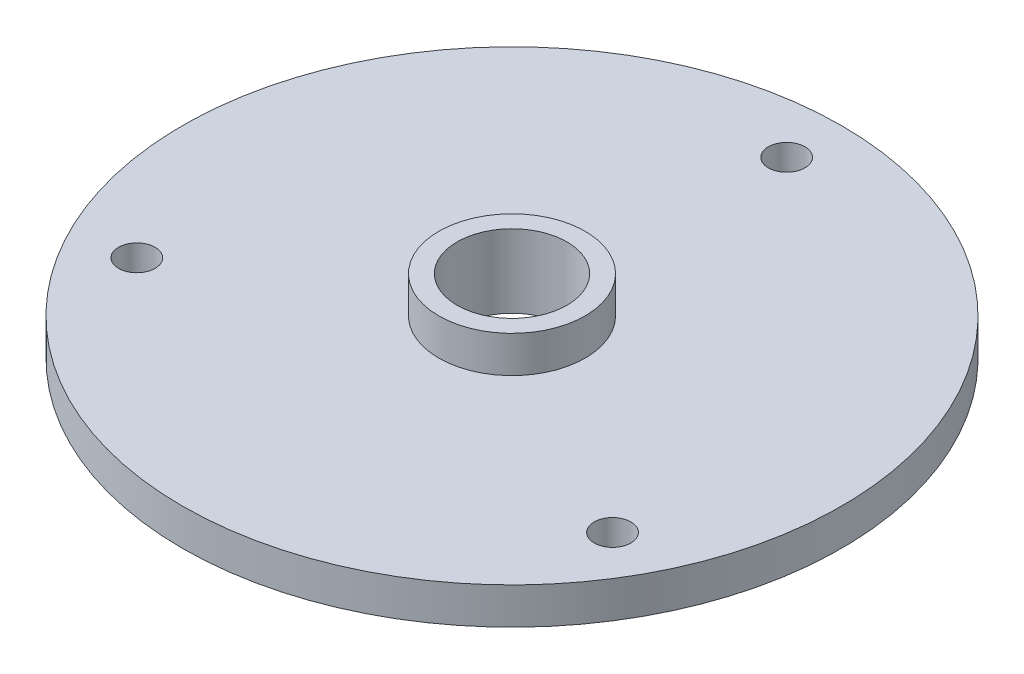
ISO-10303-21;
HEADER;
FILE_DESCRIPTION(('STEP AP214'),'2;1');
FILE_NAME('part.step','',(''),(''),'','','');
FILE_SCHEMA(('AUTOMOTIVE_DESIGN { 1 0 10303 214 1 1 1 1 }'));
ENDSEC;
DATA;
#1=APPLICATION_CONTEXT('core data for automotive mechanical design processes');
#2=APPLICATION_PROTOCOL_DEFINITION('international standard','automotive_design',2000,#1);
#3=PRODUCT_CONTEXT('',#1,'mechanical');
#4=PRODUCT('Part','Part','',(#3));
#5=PRODUCT_RELATED_PRODUCT_CATEGORY('part','',(#4));
#6=PRODUCT_DEFINITION_FORMATION('','',#4);
#7=PRODUCT_DEFINITION_CONTEXT('part definition',#1,'design');
#8=PRODUCT_DEFINITION('design','',#6,#7);
#9=PRODUCT_DEFINITION_SHAPE('','',#8);
#10=(LENGTH_UNIT() NAMED_UNIT(*) SI_UNIT(.MILLI.,.METRE.));
#11=(NAMED_UNIT(*) PLANE_ANGLE_UNIT() SI_UNIT($,.RADIAN.));
#12=(NAMED_UNIT(*) SI_UNIT($,.STERADIAN.) SOLID_ANGLE_UNIT());
#13=UNCERTAINTY_MEASURE_WITH_UNIT(LENGTH_MEASURE(1.E-05),#10,'distance_accuracy_value','');
#14=(GEOMETRIC_REPRESENTATION_CONTEXT(3) GLOBAL_UNCERTAINTY_ASSIGNED_CONTEXT((#13)) GLOBAL_UNIT_ASSIGNED_CONTEXT((#10,
#11,#12)) REPRESENTATION_CONTEXT('',''));
#15=CARTESIAN_POINT('',(0.,0.,0.));
#16=DIRECTION('',(0.,0.,1.));
#17=DIRECTION('',(1.,0.,0.));
#18=AXIS2_PLACEMENT_3D('',#15,#16,#17);
#19=CARTESIAN_POINT('',(0.,2.,0.));
#20=DIRECTION('',(0.,1.,0.));
#21=DIRECTION('',(0.,0.,1.));
#22=AXIS2_PLACEMENT_3D('',#19,#20,#21);
#23=PLANE('',#22);
#24=CARTESIAN_POINT('',(-12.9903810567656,2.,7.50000000000056));
#25=DIRECTION('',(0.,1.,0.));
#26=DIRECTION('',(0.,0.,1.));
#27=AXIS2_PLACEMENT_3D('',#24,#25,#26);
#28=CIRCLE('',#27,1.00000000000122);
#29=CARTESIAN_POINT('',(-12.9903810567656,2.,8.50000000000178));
#30=VERTEX_POINT('',#29);
#31=EDGE_CURVE('E57',#30,#30,#28,.T.);
#32=ORIENTED_EDGE('',*,*,#31,.F.);
#33=EDGE_LOOP('',(#32));
#34=FACE_BOUND('',#33,.T.);
#35=CARTESIAN_POINT('',(0.,2.,-15.));
#36=DIRECTION('',(0.,1.,0.));
#37=DIRECTION('',(0.,0.,1.));
#38=AXIS2_PLACEMENT_3D('',#35,#36,#37);
#39=CIRCLE('',#38,1.);
#40=CARTESIAN_POINT('',(0.,2.,-14.));
#41=VERTEX_POINT('',#40);
#42=EDGE_CURVE('E47',#41,#41,#39,.T.);
#43=ORIENTED_EDGE('',*,*,#42,.F.);
#44=EDGE_LOOP('',(#43));
#45=FACE_BOUND('',#44,.T.);
#46=CARTESIAN_POINT('',(0.,2.,0.));
#47=DIRECTION('',(0.,1.,0.));
#48=DIRECTION('',(0.,0.,1.));
#49=AXIS2_PLACEMENT_3D('',#46,#47,#48);
#50=CIRCLE('',#49,18.);
#51=CARTESIAN_POINT('',(0.,2.,18.));
#52=VERTEX_POINT('',#51);
#53=EDGE_CURVE('E10',#52,#52,#50,.T.);
#54=ORIENTED_EDGE('',*,*,#53,.T.);
#55=EDGE_LOOP('',(#54));
#56=FACE_BOUND('',#55,.T.);
#57=CARTESIAN_POINT('',(12.9903810567675,2.,7.49999999999944));
#58=DIRECTION('',(0.,1.,0.));
#59=DIRECTION('',(0.,0.,1.));
#60=AXIS2_PLACEMENT_3D('',#57,#58,#59);
#61=CIRCLE('',#60,1.00000000000082);
#62=CARTESIAN_POINT('',(12.9903810567675,2.,8.50000000000027));
#63=VERTEX_POINT('',#62);
#64=EDGE_CURVE('E51',#63,#63,#61,.T.);
#65=ORIENTED_EDGE('',*,*,#64,.F.);
#66=EDGE_LOOP('',(#65));
#67=FACE_BOUND('',#66,.T.);
#68=CARTESIAN_POINT('',(0.,2.,0.));
#69=DIRECTION('',(0.,1.,0.));
#70=DIRECTION('',(0.,0.,1.));
#71=AXIS2_PLACEMENT_3D('',#68,#69,#70);
#72=CIRCLE('',#71,4.);
#73=CARTESIAN_POINT('',(0.,2.,4.));
#74=VERTEX_POINT('',#73);
#75=EDGE_CURVE('E66',#74,#74,#72,.T.);
#76=ORIENTED_EDGE('',*,*,#75,.F.);
#77=EDGE_LOOP('',(#76));
#78=FACE_BOUND('',#77,.T.);
#79=ADVANCED_FACE('F32',(#34,#45,#56,#67,#78),#23,.T.);
#80=CARTESIAN_POINT('',(0.,0.,0.));
#81=DIRECTION('',(0.,1.,0.));
#82=DIRECTION('',(0.,0.,1.));
#83=AXIS2_PLACEMENT_3D('',#80,#81,#82);
#84=PLANE('',#83);
#85=CARTESIAN_POINT('',(0.,0.,0.));
#86=DIRECTION('',(0.,1.,0.));
#87=DIRECTION('',(0.,0.,1.));
#88=AXIS2_PLACEMENT_3D('',#85,#86,#87);
#89=CIRCLE('',#88,18.);
#90=CARTESIAN_POINT('',(0.,0.,18.));
#91=VERTEX_POINT('',#90);
#92=EDGE_CURVE('E36',#91,#91,#89,.T.);
#93=ORIENTED_EDGE('',*,*,#92,.F.);
#94=EDGE_LOOP('',(#93));
#95=FACE_BOUND('',#94,.T.);
#96=CARTESIAN_POINT('',(0.,0.,0.));
#97=DIRECTION('',(0.,1.,0.));
#98=DIRECTION('',(0.,0.,1.));
#99=AXIS2_PLACEMENT_3D('',#96,#97,#98);
#100=CIRCLE('',#99,3.);
#101=CARTESIAN_POINT('',(0.,0.,3.));
#102=VERTEX_POINT('',#101);
#103=EDGE_CURVE('E43',#102,#102,#100,.T.);
#104=ORIENTED_EDGE('',*,*,#103,.T.);
#105=EDGE_LOOP('',(#104));
#106=FACE_BOUND('',#105,.T.);
#107=CARTESIAN_POINT('',(0.,0.,-15.));
#108=DIRECTION('',(0.,1.,0.));
#109=DIRECTION('',(0.,0.,1.));
#110=AXIS2_PLACEMENT_3D('',#107,#108,#109);
#111=CIRCLE('',#110,1.);
#112=CARTESIAN_POINT('',(0.,0.,-14.));
#113=VERTEX_POINT('',#112);
#114=EDGE_CURVE('E48',#113,#113,#111,.T.);
#115=ORIENTED_EDGE('',*,*,#114,.T.);
#116=EDGE_LOOP('',(#115));
#117=FACE_BOUND('',#116,.T.);
#118=CARTESIAN_POINT('',(12.9903810567675,0.,7.49999999999944));
#119=DIRECTION('',(0.,1.,0.));
#120=DIRECTION('',(0.,0.,1.));
#121=AXIS2_PLACEMENT_3D('',#118,#119,#120);
#122=CIRCLE('',#121,1.00000000000082);
#123=CARTESIAN_POINT('',(12.9903810567675,0.,8.50000000000027));
#124=VERTEX_POINT('',#123);
#125=EDGE_CURVE('E54',#124,#124,#122,.T.);
#126=ORIENTED_EDGE('',*,*,#125,.T.);
#127=EDGE_LOOP('',(#126));
#128=FACE_BOUND('',#127,.T.);
#129=CARTESIAN_POINT('',(-12.9903810567656,0.,7.50000000000056));
#130=DIRECTION('',(0.,1.,0.));
#131=DIRECTION('',(0.,0.,1.));
#132=AXIS2_PLACEMENT_3D('',#129,#130,#131);
#133=CIRCLE('',#132,1.00000000000122);
#134=CARTESIAN_POINT('',(-12.9903810567656,0.,8.50000000000178));
#135=VERTEX_POINT('',#134);
#136=EDGE_CURVE('E60',#135,#135,#133,.T.);
#137=ORIENTED_EDGE('',*,*,#136,.T.);
#138=EDGE_LOOP('',(#137));
#139=FACE_BOUND('',#138,.T.);
#140=ADVANCED_FACE('F93',(#95,#106,#117,#128,#139),#84,.F.);
#141=CARTESIAN_POINT('',(0.,2.,0.));
#142=DIRECTION('',(0.,-1.,0.));
#143=DIRECTION('',(0.,0.,-1.));
#144=AXIS2_PLACEMENT_3D('',#141,#142,#143);
#145=CYLINDRICAL_SURFACE('',#144,18.);
#146=ORIENTED_EDGE('',*,*,#53,.F.);
#147=EDGE_LOOP('',(#146));
#148=FACE_BOUND('',#147,.T.);
#149=ORIENTED_EDGE('',*,*,#92,.T.);
#150=EDGE_LOOP('',(#149));
#151=FACE_BOUND('',#150,.T.);
#152=ADVANCED_FACE('F34',(#148,#151),#145,.T.);
#153=CARTESIAN_POINT('',(0.,2.,0.));
#154=DIRECTION('',(0.,-1.,0.));
#155=DIRECTION('',(0.,0.,-1.));
#156=AXIS2_PLACEMENT_3D('',#153,#154,#155);
#157=CYLINDRICAL_SURFACE('',#156,3.);
#158=ORIENTED_EDGE('',*,*,#103,.F.);
#159=EDGE_LOOP('',(#158));
#160=FACE_BOUND('',#159,.T.);
#161=CARTESIAN_POINT('',(0.,4.,0.));
#162=DIRECTION('',(0.,1.,0.));
#163=DIRECTION('',(0.,0.,1.));
#164=AXIS2_PLACEMENT_3D('',#161,#162,#163);
#165=CIRCLE('',#164,3.);
#166=CARTESIAN_POINT('',(0.,4.,3.));
#167=VERTEX_POINT('',#166);
#168=EDGE_CURVE('E69',#167,#167,#165,.T.);
#169=ORIENTED_EDGE('',*,*,#168,.T.);
#170=EDGE_LOOP('',(#169));
#171=FACE_BOUND('',#170,.T.);
#172=ADVANCED_FACE('F75',(#160,#171),#157,.F.);
#173=CARTESIAN_POINT('',(0.,2.,-15.));
#174=DIRECTION('',(0.,-1.,0.));
#175=DIRECTION('',(0.,0.,-1.));
#176=AXIS2_PLACEMENT_3D('',#173,#174,#175);
#177=CYLINDRICAL_SURFACE('',#176,1.);
#178=ORIENTED_EDGE('',*,*,#42,.T.);
#179=EDGE_LOOP('',(#178));
#180=FACE_BOUND('',#179,.T.);
#181=ORIENTED_EDGE('',*,*,#114,.F.);
#182=EDGE_LOOP('',(#181));
#183=FACE_BOUND('',#182,.T.);
#184=ADVANCED_FACE('F105',(#180,#183),#177,.F.);
#185=CARTESIAN_POINT('',(12.9903810567675,2.,7.49999999999944));
#186=DIRECTION('',(0.,-1.,0.));
#187=DIRECTION('',(0.,0.,-1.));
#188=AXIS2_PLACEMENT_3D('',#185,#186,#187);
#189=CYLINDRICAL_SURFACE('',#188,1.00000000000082);
#190=ORIENTED_EDGE('',*,*,#64,.T.);
#191=EDGE_LOOP('',(#190));
#192=FACE_BOUND('',#191,.T.);
#193=ORIENTED_EDGE('',*,*,#125,.F.);
#194=EDGE_LOOP('',(#193));
#195=FACE_BOUND('',#194,.T.);
#196=ADVANCED_FACE('F89',(#192,#195),#189,.F.);
#197=CARTESIAN_POINT('',(-12.9903810567656,2.,7.50000000000056));
#198=DIRECTION('',(0.,-1.,0.));
#199=DIRECTION('',(0.,0.,-1.));
#200=AXIS2_PLACEMENT_3D('',#197,#198,#199);
#201=CYLINDRICAL_SURFACE('',#200,1.00000000000122);
#202=ORIENTED_EDGE('',*,*,#31,.T.);
#203=EDGE_LOOP('',(#202));
#204=FACE_BOUND('',#203,.T.);
#205=ORIENTED_EDGE('',*,*,#136,.F.);
#206=EDGE_LOOP('',(#205));
#207=FACE_BOUND('',#206,.T.);
#208=ADVANCED_FACE('F80',(#204,#207),#201,.F.);
#209=CARTESIAN_POINT('',(0.,4.,0.));
#210=DIRECTION('',(0.,1.,0.));
#211=DIRECTION('',(0.,0.,1.));
#212=AXIS2_PLACEMENT_3D('',#209,#210,#211);
#213=PLANE('',#212);
#214=CARTESIAN_POINT('',(0.,4.,0.));
#215=DIRECTION('',(0.,1.,0.));
#216=DIRECTION('',(0.,0.,1.));
#217=AXIS2_PLACEMENT_3D('',#214,#215,#216);
#218=CIRCLE('',#217,4.);
#219=CARTESIAN_POINT('',(0.,4.,4.));
#220=VERTEX_POINT('',#219);
#221=EDGE_CURVE('E63',#220,#220,#218,.T.);
#222=ORIENTED_EDGE('',*,*,#221,.T.);
#223=EDGE_LOOP('',(#222));
#224=FACE_BOUND('',#223,.T.);
#225=ORIENTED_EDGE('',*,*,#168,.F.);
#226=EDGE_LOOP('',(#225));
#227=FACE_BOUND('',#226,.T.);
#228=ADVANCED_FACE('F77',(#224,#227),#213,.T.);
#229=CARTESIAN_POINT('',(0.,4.,0.));
#230=DIRECTION('',(0.,-1.,0.));
#231=DIRECTION('',(0.,0.,-1.));
#232=AXIS2_PLACEMENT_3D('',#229,#230,#231);
#233=CYLINDRICAL_SURFACE('',#232,4.);
#234=ORIENTED_EDGE('',*,*,#221,.F.);
#235=EDGE_LOOP('',(#234));
#236=FACE_BOUND('',#235,.T.);
#237=ORIENTED_EDGE('',*,*,#75,.T.);
#238=EDGE_LOOP('',(#237));
#239=FACE_BOUND('',#238,.T.);
#240=ADVANCED_FACE('F79',(#236,#239),#233,.T.);
#241=CLOSED_SHELL('',(#79,#140,#152,#172,#184,#196,#208,#228,#240));
#242=MANIFOLD_SOLID_BREP('B2',#241);
#243=ADVANCED_BREP_SHAPE_REPRESENTATION('',(#18,#242),#14);
#244=SHAPE_DEFINITION_REPRESENTATION(#9,#243);
ENDSEC;
END-ISO-10303-21;
